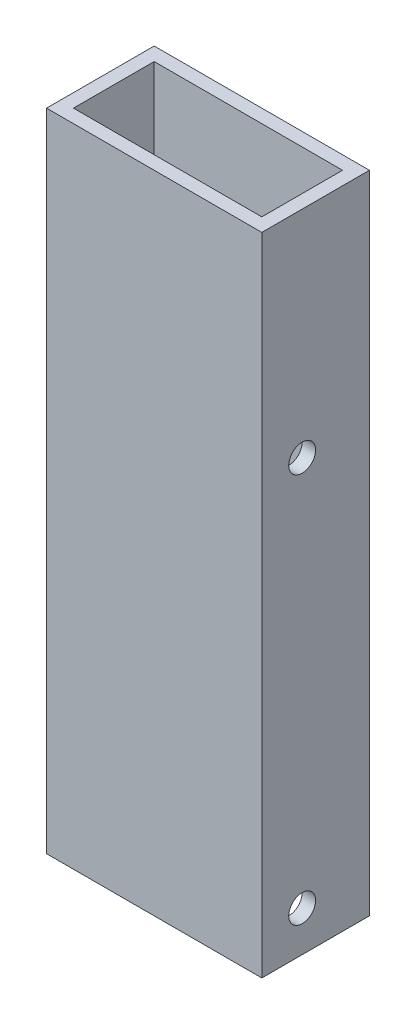
ISO-10303-21;
HEADER;
FILE_DESCRIPTION(('STEP AP214'),'2;1');
FILE_NAME('part.step','',(''),(''),'','','');
FILE_SCHEMA(('AUTOMOTIVE_DESIGN { 1 0 10303 214 1 1 1 1 }'));
ENDSEC;
DATA;
#1=APPLICATION_CONTEXT('core data for automotive mechanical design processes');
#2=APPLICATION_PROTOCOL_DEFINITION('international standard','automotive_design',2000,#1);
#3=PRODUCT_CONTEXT('',#1,'mechanical');
#4=PRODUCT('Part','Part','',(#3));
#5=PRODUCT_RELATED_PRODUCT_CATEGORY('part','',(#4));
#6=PRODUCT_DEFINITION_FORMATION('','',#4);
#7=PRODUCT_DEFINITION_CONTEXT('part definition',#1,'design');
#8=PRODUCT_DEFINITION('design','',#6,#7);
#9=PRODUCT_DEFINITION_SHAPE('','',#8);
#10=(LENGTH_UNIT() NAMED_UNIT(*) SI_UNIT(.MILLI.,.METRE.));
#11=(NAMED_UNIT(*) PLANE_ANGLE_UNIT() SI_UNIT($,.RADIAN.));
#12=(NAMED_UNIT(*) SI_UNIT($,.STERADIAN.) SOLID_ANGLE_UNIT());
#13=UNCERTAINTY_MEASURE_WITH_UNIT(LENGTH_MEASURE(1.E-05),#10,'distance_accuracy_value','');
#14=(GEOMETRIC_REPRESENTATION_CONTEXT(3) GLOBAL_UNCERTAINTY_ASSIGNED_CONTEXT((#13)) GLOBAL_UNIT_ASSIGNED_CONTEXT((#10,
#11,#12)) REPRESENTATION_CONTEXT('',''));
#15=CARTESIAN_POINT('',(0.,0.,0.));
#16=DIRECTION('',(0.,0.,1.));
#17=DIRECTION('',(1.,0.,0.));
#18=AXIS2_PLACEMENT_3D('',#15,#16,#17);
#19=CARTESIAN_POINT('',(0.,76.2,0.));
#20=DIRECTION('',(0.,1.,0.));
#21=DIRECTION('',(0.,0.,1.));
#22=AXIS2_PLACEMENT_3D('',#19,#20,#21);
#23=PLANE('',#22);
#24=DIRECTION('',(0.,0.,-1.));
#25=VECTOR('',#24,1.);
#26=CARTESIAN_POINT('',(25.4,76.2,-12.7));
#27=LINE('',#26,#25);
#28=CARTESIAN_POINT('',(25.4,76.2,12.7));
#29=VERTEX_POINT('',#28);
#30=CARTESIAN_POINT('',(25.4,76.2,-12.7));
#31=VERTEX_POINT('',#30);
#32=EDGE_CURVE('E143',#29,#31,#27,.T.);
#33=ORIENTED_EDGE('',*,*,#32,.T.);
#34=DIRECTION('',(-1.,0.,0.));
#35=VECTOR('',#34,1.);
#36=CARTESIAN_POINT('',(-25.4,76.2,-12.7));
#37=LINE('',#36,#35);
#38=CARTESIAN_POINT('',(-25.4,76.2,-12.7));
#39=VERTEX_POINT('',#38);
#40=EDGE_CURVE('E146',#31,#39,#37,.T.);
#41=ORIENTED_EDGE('',*,*,#40,.T.);
#42=DIRECTION('',(0.,0.,1.));
#43=VECTOR('',#42,1.);
#44=CARTESIAN_POINT('',(-25.4,76.2,-12.7));
#45=LINE('',#44,#43);
#46=CARTESIAN_POINT('',(-25.4,76.2,12.7));
#47=VERTEX_POINT('',#46);
#48=EDGE_CURVE('E149',#39,#47,#45,.T.);
#49=ORIENTED_EDGE('',*,*,#48,.T.);
#50=DIRECTION('',(1.,0.,0.));
#51=VECTOR('',#50,1.);
#52=CARTESIAN_POINT('',(-25.4,76.2,12.7));
#53=LINE('',#52,#51);
#54=EDGE_CURVE('E151',#47,#29,#53,.T.);
#55=ORIENTED_EDGE('',*,*,#54,.T.);
#56=EDGE_LOOP('',(#33,#41,#49,#55));
#57=FACE_BOUND('',#56,.T.);
#58=DIRECTION('',(-1.,0.,0.));
#59=VECTOR('',#58,1.);
#60=CARTESIAN_POINT('',(-22.225,76.2,-9.525));
#61=LINE('',#60,#59);
#62=CARTESIAN_POINT('',(22.225,76.2,-9.525));
#63=VERTEX_POINT('',#62);
#64=CARTESIAN_POINT('',(-22.225,76.2,-9.525));
#65=VERTEX_POINT('',#64);
#66=EDGE_CURVE('E113',#63,#65,#61,.T.);
#67=ORIENTED_EDGE('',*,*,#66,.F.);
#68=DIRECTION('',(0.,0.,-1.));
#69=VECTOR('',#68,1.);
#70=CARTESIAN_POINT('',(22.225,76.2,-9.525));
#71=LINE('',#70,#69);
#72=CARTESIAN_POINT('',(22.225,76.2,9.525));
#73=VERTEX_POINT('',#72);
#74=EDGE_CURVE('E105',#73,#63,#71,.T.);
#75=ORIENTED_EDGE('',*,*,#74,.F.);
#76=DIRECTION('',(1.,0.,0.));
#77=VECTOR('',#76,1.);
#78=CARTESIAN_POINT('',(-22.225,76.2,9.525));
#79=LINE('',#78,#77);
#80=CARTESIAN_POINT('',(-22.225,76.2,9.525));
#81=VERTEX_POINT('',#80);
#82=EDGE_CURVE('E127',#81,#73,#79,.T.);
#83=ORIENTED_EDGE('',*,*,#82,.F.);
#84=DIRECTION('',(0.,0.,1.));
#85=VECTOR('',#84,1.);
#86=CARTESIAN_POINT('',(-22.225,76.2,-9.525));
#87=LINE('',#86,#85);
#88=EDGE_CURVE('E125',#65,#81,#87,.T.);
#89=ORIENTED_EDGE('',*,*,#88,.F.);
#90=EDGE_LOOP('',(#67,#75,#83,#89));
#91=FACE_BOUND('',#90,.T.);
#92=ADVANCED_FACE('F38',(#57,#91),#23,.T.);
#93=CARTESIAN_POINT('',(0.,-76.2,0.));
#94=DIRECTION('',(0.,1.,0.));
#95=DIRECTION('',(0.,0.,1.));
#96=AXIS2_PLACEMENT_3D('',#93,#94,#95);
#97=PLANE('',#96);
#98=DIRECTION('',(0.,0.,-1.));
#99=VECTOR('',#98,1.);
#100=CARTESIAN_POINT('',(25.4,-76.2,-12.7));
#101=LINE('',#100,#99);
#102=CARTESIAN_POINT('',(25.4,-76.2,12.7));
#103=VERTEX_POINT('',#102);
#104=CARTESIAN_POINT('',(25.4,-76.2,-12.7));
#105=VERTEX_POINT('',#104);
#106=EDGE_CURVE('E121',#103,#105,#101,.T.);
#107=ORIENTED_EDGE('',*,*,#106,.F.);
#108=DIRECTION('',(1.,0.,0.));
#109=VECTOR('',#108,1.);
#110=CARTESIAN_POINT('',(-25.4,-76.2,12.7));
#111=LINE('',#110,#109);
#112=CARTESIAN_POINT('',(-25.4,-76.2,12.7));
#113=VERTEX_POINT('',#112);
#114=EDGE_CURVE('E147',#113,#103,#111,.T.);
#115=ORIENTED_EDGE('',*,*,#114,.F.);
#116=DIRECTION('',(0.,0.,1.));
#117=VECTOR('',#116,1.);
#118=CARTESIAN_POINT('',(-25.4,-76.2,-12.7));
#119=LINE('',#118,#117);
#120=CARTESIAN_POINT('',(-25.4,-76.2,-12.7));
#121=VERTEX_POINT('',#120);
#122=EDGE_CURVE('E158',#121,#113,#119,.T.);
#123=ORIENTED_EDGE('',*,*,#122,.F.);
#124=DIRECTION('',(-1.,0.,0.));
#125=VECTOR('',#124,1.);
#126=CARTESIAN_POINT('',(-25.4,-76.2,-12.7));
#127=LINE('',#126,#125);
#128=EDGE_CURVE('E156',#105,#121,#127,.T.);
#129=ORIENTED_EDGE('',*,*,#128,.F.);
#130=EDGE_LOOP('',(#107,#115,#123,#129));
#131=FACE_BOUND('',#130,.T.);
#132=DIRECTION('',(0.,0.,-1.));
#133=VECTOR('',#132,1.);
#134=CARTESIAN_POINT('',(22.225,-76.2,-9.525));
#135=LINE('',#134,#133);
#136=CARTESIAN_POINT('',(22.225,-76.2,9.525));
#137=VERTEX_POINT('',#136);
#138=CARTESIAN_POINT('',(22.225,-76.2,-9.525));
#139=VERTEX_POINT('',#138);
#140=EDGE_CURVE('E63',#137,#139,#135,.T.);
#141=ORIENTED_EDGE('',*,*,#140,.T.);
#142=DIRECTION('',(-1.,0.,0.));
#143=VECTOR('',#142,1.);
#144=CARTESIAN_POINT('',(-22.225,-76.2,-9.525));
#145=LINE('',#144,#143);
#146=CARTESIAN_POINT('',(-22.225,-76.2,-9.525));
#147=VERTEX_POINT('',#146);
#148=EDGE_CURVE('E120',#139,#147,#145,.T.);
#149=ORIENTED_EDGE('',*,*,#148,.T.);
#150=DIRECTION('',(0.,0.,1.));
#151=VECTOR('',#150,1.);
#152=CARTESIAN_POINT('',(-22.225,-76.2,-9.525));
#153=LINE('',#152,#151);
#154=CARTESIAN_POINT('',(-22.225,-76.2,9.525));
#155=VERTEX_POINT('',#154);
#156=EDGE_CURVE('E135',#147,#155,#153,.T.);
#157=ORIENTED_EDGE('',*,*,#156,.T.);
#158=DIRECTION('',(1.,0.,0.));
#159=VECTOR('',#158,1.);
#160=CARTESIAN_POINT('',(-22.225,-76.2,9.525));
#161=LINE('',#160,#159);
#162=EDGE_CURVE('E114',#155,#137,#161,.T.);
#163=ORIENTED_EDGE('',*,*,#162,.T.);
#164=EDGE_LOOP('',(#141,#149,#157,#163));
#165=FACE_BOUND('',#164,.T.);
#166=ADVANCED_FACE('F205',(#131,#165),#97,.F.);
#167=CARTESIAN_POINT('',(25.4,76.2,-12.7));
#168=DIRECTION('',(-1.,0.,0.));
#169=DIRECTION('',(0.,0.,1.));
#170=AXIS2_PLACEMENT_3D('',#167,#168,#169);
#171=PLANE('',#170);
#172=CARTESIAN_POINT('',(25.4,-66.675,3.175));
#173=DIRECTION('',(-1.,0.,0.));
#174=DIRECTION('',(0.,0.,1.));
#175=AXIS2_PLACEMENT_3D('',#172,#173,#174);
#176=CIRCLE('',#175,3.175);
#177=CARTESIAN_POINT('',(25.4,-66.675,6.34999999999999));
#178=VERTEX_POINT('',#177);
#179=EDGE_CURVE('E170',#178,#178,#176,.T.);
#180=ORIENTED_EDGE('',*,*,#179,.T.);
#181=EDGE_LOOP('',(#180));
#182=FACE_BOUND('',#181,.T.);
#183=CARTESIAN_POINT('',(25.4,25.4,3.175));
#184=DIRECTION('',(-1.,0.,0.));
#185=DIRECTION('',(0.,0.,1.));
#186=AXIS2_PLACEMENT_3D('',#183,#184,#185);
#187=CIRCLE('',#186,3.175);
#188=CARTESIAN_POINT('',(25.4,25.4,6.35));
#189=VERTEX_POINT('',#188);
#190=EDGE_CURVE('E181',#189,#189,#187,.T.);
#191=ORIENTED_EDGE('',*,*,#190,.T.);
#192=EDGE_LOOP('',(#191));
#193=FACE_BOUND('',#192,.T.);
#194=ORIENTED_EDGE('',*,*,#106,.T.);
#195=DIRECTION('',(0.,-1.,0.));
#196=VECTOR('',#195,1.);
#197=CARTESIAN_POINT('',(25.4,76.2,-12.7));
#198=LINE('',#197,#196);
#199=EDGE_CURVE('E11',#31,#105,#198,.T.);
#200=ORIENTED_EDGE('',*,*,#199,.F.);
#201=ORIENTED_EDGE('',*,*,#32,.F.);
#202=DIRECTION('',(0.,-1.,0.));
#203=VECTOR('',#202,1.);
#204=CARTESIAN_POINT('',(25.4,76.2,12.7));
#205=LINE('',#204,#203);
#206=EDGE_CURVE('E153',#29,#103,#205,.T.);
#207=ORIENTED_EDGE('',*,*,#206,.T.);
#208=EDGE_LOOP('',(#194,#200,#201,#207));
#209=FACE_BOUND('',#208,.T.);
#210=ADVANCED_FACE('F40',(#182,#193,#209),#171,.F.);
#211=CARTESIAN_POINT('',(-25.4,76.2,-12.7));
#212=DIRECTION('',(0.,0.,1.));
#213=DIRECTION('',(1.,0.,0.));
#214=AXIS2_PLACEMENT_3D('',#211,#212,#213);
#215=PLANE('',#214);
#216=ORIENTED_EDGE('',*,*,#128,.T.);
#217=DIRECTION('',(0.,-1.,0.));
#218=VECTOR('',#217,1.);
#219=CARTESIAN_POINT('',(-25.4,76.2,-12.7));
#220=LINE('',#219,#218);
#221=EDGE_CURVE('E47',#39,#121,#220,.T.);
#222=ORIENTED_EDGE('',*,*,#221,.F.);
#223=ORIENTED_EDGE('',*,*,#40,.F.);
#224=ORIENTED_EDGE('',*,*,#199,.T.);
#225=EDGE_LOOP('',(#216,#222,#223,#224));
#226=FACE_BOUND('',#225,.T.);
#227=ADVANCED_FACE('F231',(#226),#215,.F.);
#228=CARTESIAN_POINT('',(-25.4,76.2,-12.7));
#229=DIRECTION('',(1.,0.,0.));
#230=DIRECTION('',(0.,0.,-1.));
#231=AXIS2_PLACEMENT_3D('',#228,#229,#230);
#232=PLANE('',#231);
#233=CARTESIAN_POINT('',(-25.4,-66.675,3.175));
#234=DIRECTION('',(-1.,0.,0.));
#235=DIRECTION('',(0.,0.,1.));
#236=AXIS2_PLACEMENT_3D('',#233,#234,#235);
#237=CIRCLE('',#236,3.175);
#238=CARTESIAN_POINT('',(-25.4,-66.675,6.34999999999999));
#239=VERTEX_POINT('',#238);
#240=EDGE_CURVE('E176',#239,#239,#237,.T.);
#241=ORIENTED_EDGE('',*,*,#240,.F.);
#242=EDGE_LOOP('',(#241));
#243=FACE_BOUND('',#242,.T.);
#244=CARTESIAN_POINT('',(-25.4,25.4,3.175));
#245=DIRECTION('',(-1.,0.,0.));
#246=DIRECTION('',(0.,0.,1.));
#247=AXIS2_PLACEMENT_3D('',#244,#245,#246);
#248=CIRCLE('',#247,3.175);
#249=CARTESIAN_POINT('',(-25.4,25.4,6.35));
#250=VERTEX_POINT('',#249);
#251=EDGE_CURVE('E186',#250,#250,#248,.T.);
#252=ORIENTED_EDGE('',*,*,#251,.F.);
#253=EDGE_LOOP('',(#252));
#254=FACE_BOUND('',#253,.T.);
#255=ORIENTED_EDGE('',*,*,#122,.T.);
#256=DIRECTION('',(0.,-1.,0.));
#257=VECTOR('',#256,1.);
#258=CARTESIAN_POINT('',(-25.4,76.2,12.7));
#259=LINE('',#258,#257);
#260=EDGE_CURVE('E163',#47,#113,#259,.T.);
#261=ORIENTED_EDGE('',*,*,#260,.F.);
#262=ORIENTED_EDGE('',*,*,#48,.F.);
#263=ORIENTED_EDGE('',*,*,#221,.T.);
#264=EDGE_LOOP('',(#255,#261,#262,#263));
#265=FACE_BOUND('',#264,.T.);
#266=ADVANCED_FACE('F228',(#243,#254,#265),#232,.F.);
#267=CARTESIAN_POINT('',(-25.4,76.2,12.7));
#268=DIRECTION('',(0.,0.,-1.));
#269=DIRECTION('',(-1.,0.,0.));
#270=AXIS2_PLACEMENT_3D('',#267,#268,#269);
#271=PLANE('',#270);
#272=ORIENTED_EDGE('',*,*,#114,.T.);
#273=ORIENTED_EDGE('',*,*,#206,.F.);
#274=ORIENTED_EDGE('',*,*,#54,.F.);
#275=ORIENTED_EDGE('',*,*,#260,.T.);
#276=EDGE_LOOP('',(#272,#273,#274,#275));
#277=FACE_BOUND('',#276,.T.);
#278=ADVANCED_FACE('F225',(#277),#271,.F.);
#279=CARTESIAN_POINT('',(22.225,76.2,-9.525));
#280=DIRECTION('',(-1.,0.,0.));
#281=DIRECTION('',(0.,0.,1.));
#282=AXIS2_PLACEMENT_3D('',#279,#280,#281);
#283=PLANE('',#282);
#284=CARTESIAN_POINT('',(22.225,-66.675,3.175));
#285=DIRECTION('',(-1.,0.,0.));
#286=DIRECTION('',(0.,0.,1.));
#287=AXIS2_PLACEMENT_3D('',#284,#285,#286);
#288=CIRCLE('',#287,3.175);
#289=CARTESIAN_POINT('',(22.225,-66.675,6.34999999999999));
#290=VERTEX_POINT('',#289);
#291=EDGE_CURVE('E133',#290,#290,#288,.T.);
#292=ORIENTED_EDGE('',*,*,#291,.F.);
#293=EDGE_LOOP('',(#292));
#294=FACE_BOUND('',#293,.T.);
#295=CARTESIAN_POINT('',(22.225,25.4,3.175));
#296=DIRECTION('',(-1.,0.,0.));
#297=DIRECTION('',(0.,0.,1.));
#298=AXIS2_PLACEMENT_3D('',#295,#296,#297);
#299=CIRCLE('',#298,3.175);
#300=CARTESIAN_POINT('',(22.225,25.4,6.35));
#301=VERTEX_POINT('',#300);
#302=EDGE_CURVE('E169',#301,#301,#299,.T.);
#303=ORIENTED_EDGE('',*,*,#302,.F.);
#304=EDGE_LOOP('',(#303));
#305=FACE_BOUND('',#304,.T.);
#306=ORIENTED_EDGE('',*,*,#140,.F.);
#307=DIRECTION('',(0.,-1.,0.));
#308=VECTOR('',#307,1.);
#309=CARTESIAN_POINT('',(22.225,76.2,9.525));
#310=LINE('',#309,#308);
#311=EDGE_CURVE('E109',#73,#137,#310,.T.);
#312=ORIENTED_EDGE('',*,*,#311,.F.);
#313=ORIENTED_EDGE('',*,*,#74,.T.);
#314=DIRECTION('',(0.,-1.,0.));
#315=VECTOR('',#314,1.);
#316=CARTESIAN_POINT('',(22.225,76.2,-9.525));
#317=LINE('',#316,#315);
#318=EDGE_CURVE('E108',#63,#139,#317,.T.);
#319=ORIENTED_EDGE('',*,*,#318,.T.);
#320=EDGE_LOOP('',(#306,#312,#313,#319));
#321=FACE_BOUND('',#320,.T.);
#322=ADVANCED_FACE('F107',(#294,#305,#321),#283,.T.);
#323=CARTESIAN_POINT('',(-22.225,76.2,-9.525));
#324=DIRECTION('',(0.,0.,1.));
#325=DIRECTION('',(1.,0.,0.));
#326=AXIS2_PLACEMENT_3D('',#323,#324,#325);
#327=PLANE('',#326);
#328=ORIENTED_EDGE('',*,*,#148,.F.);
#329=ORIENTED_EDGE('',*,*,#318,.F.);
#330=ORIENTED_EDGE('',*,*,#66,.T.);
#331=DIRECTION('',(0.,-1.,0.));
#332=VECTOR('',#331,1.);
#333=CARTESIAN_POINT('',(-22.225,76.2,-9.525));
#334=LINE('',#333,#332);
#335=EDGE_CURVE('E122',#65,#147,#334,.T.);
#336=ORIENTED_EDGE('',*,*,#335,.T.);
#337=EDGE_LOOP('',(#328,#329,#330,#336));
#338=FACE_BOUND('',#337,.T.);
#339=ADVANCED_FACE('F117',(#338),#327,.T.);
#340=CARTESIAN_POINT('',(-22.225,76.2,-9.525));
#341=DIRECTION('',(1.,0.,0.));
#342=DIRECTION('',(0.,0.,-1.));
#343=AXIS2_PLACEMENT_3D('',#340,#341,#342);
#344=PLANE('',#343);
#345=CARTESIAN_POINT('',(-22.225,-66.675,3.175));
#346=DIRECTION('',(1.,0.,0.));
#347=DIRECTION('',(0.,0.,-1.));
#348=AXIS2_PLACEMENT_3D('',#345,#346,#347);
#349=CIRCLE('',#348,3.175);
#350=CARTESIAN_POINT('',(-22.225,-66.675,0.));
#351=VERTEX_POINT('',#350);
#352=EDGE_CURVE('E42',#351,#351,#349,.T.);
#353=ORIENTED_EDGE('',*,*,#352,.F.);
#354=EDGE_LOOP('',(#353));
#355=FACE_BOUND('',#354,.T.);
#356=CARTESIAN_POINT('',(-22.225,25.4,3.175));
#357=DIRECTION('',(1.,0.,0.));
#358=DIRECTION('',(0.,0.,-1.));
#359=AXIS2_PLACEMENT_3D('',#356,#357,#358);
#360=CIRCLE('',#359,3.175);
#361=CARTESIAN_POINT('',(-22.225,25.4,0.));
#362=VERTEX_POINT('',#361);
#363=EDGE_CURVE('E167',#362,#362,#360,.T.);
#364=ORIENTED_EDGE('',*,*,#363,.F.);
#365=EDGE_LOOP('',(#364));
#366=FACE_BOUND('',#365,.T.);
#367=ORIENTED_EDGE('',*,*,#156,.F.);
#368=ORIENTED_EDGE('',*,*,#335,.F.);
#369=ORIENTED_EDGE('',*,*,#88,.T.);
#370=DIRECTION('',(0.,-1.,0.));
#371=VECTOR('',#370,1.);
#372=CARTESIAN_POINT('',(-22.225,76.2,9.525));
#373=LINE('',#372,#371);
#374=EDGE_CURVE('E55',#81,#155,#373,.T.);
#375=ORIENTED_EDGE('',*,*,#374,.T.);
#376=EDGE_LOOP('',(#367,#368,#369,#375));
#377=FACE_BOUND('',#376,.T.);
#378=ADVANCED_FACE('F197',(#355,#366,#377),#344,.T.);
#379=CARTESIAN_POINT('',(-22.225,76.2,9.525));
#380=DIRECTION('',(0.,0.,-1.));
#381=DIRECTION('',(-1.,0.,0.));
#382=AXIS2_PLACEMENT_3D('',#379,#380,#381);
#383=PLANE('',#382);
#384=ORIENTED_EDGE('',*,*,#162,.F.);
#385=ORIENTED_EDGE('',*,*,#374,.F.);
#386=ORIENTED_EDGE('',*,*,#82,.T.);
#387=ORIENTED_EDGE('',*,*,#311,.T.);
#388=EDGE_LOOP('',(#384,#385,#386,#387));
#389=FACE_BOUND('',#388,.T.);
#390=ADVANCED_FACE('F200',(#389),#383,.T.);
#391=CARTESIAN_POINT('',(25.4,25.4,3.175));
#392=DIRECTION('',(-1.,0.,0.));
#393=DIRECTION('',(0.,0.,1.));
#394=AXIS2_PLACEMENT_3D('',#391,#392,#393);
#395=CYLINDRICAL_SURFACE('',#394,3.175);
#396=ORIENTED_EDGE('',*,*,#363,.T.);
#397=EDGE_LOOP('',(#396));
#398=FACE_BOUND('',#397,.T.);
#399=ORIENTED_EDGE('',*,*,#251,.T.);
#400=EDGE_LOOP('',(#399));
#401=FACE_BOUND('',#400,.T.);
#402=ADVANCED_FACE('F207',(#398,#401),#395,.F.);
#403=CARTESIAN_POINT('',(25.4,-66.675,3.175));
#404=DIRECTION('',(-1.,0.,0.));
#405=DIRECTION('',(0.,0.,1.));
#406=AXIS2_PLACEMENT_3D('',#403,#404,#405);
#407=CYLINDRICAL_SURFACE('',#406,3.175);
#408=ORIENTED_EDGE('',*,*,#352,.T.);
#409=EDGE_LOOP('',(#408));
#410=FACE_BOUND('',#409,.T.);
#411=ORIENTED_EDGE('',*,*,#240,.T.);
#412=EDGE_LOOP('',(#411));
#413=FACE_BOUND('',#412,.T.);
#414=ADVANCED_FACE('F194',(#410,#413),#407,.F.);
#415=ORIENTED_EDGE('',*,*,#302,.T.);
#416=EDGE_LOOP('',(#415));
#417=FACE_BOUND('',#416,.T.);
#418=ORIENTED_EDGE('',*,*,#190,.F.);
#419=EDGE_LOOP('',(#418));
#420=FACE_BOUND('',#419,.T.);
#421=ADVANCED_FACE('F213',(#417,#420),#395,.F.);
#422=ORIENTED_EDGE('',*,*,#291,.T.);
#423=EDGE_LOOP('',(#422));
#424=FACE_BOUND('',#423,.T.);
#425=ORIENTED_EDGE('',*,*,#179,.F.);
#426=EDGE_LOOP('',(#425));
#427=FACE_BOUND('',#426,.T.);
#428=ADVANCED_FACE('F256',(#424,#427),#407,.F.);
#429=CLOSED_SHELL('',(#92,#166,#210,#227,#266,#278,#322,#339,#378,#390,#402,#414,#421,#428));
#430=MANIFOLD_SOLID_BREP('B2',#429);
#431=ADVANCED_BREP_SHAPE_REPRESENTATION('',(#18,#430),#14);
#432=SHAPE_DEFINITION_REPRESENTATION(#9,#431);
ENDSEC;
END-ISO-10303-21;
